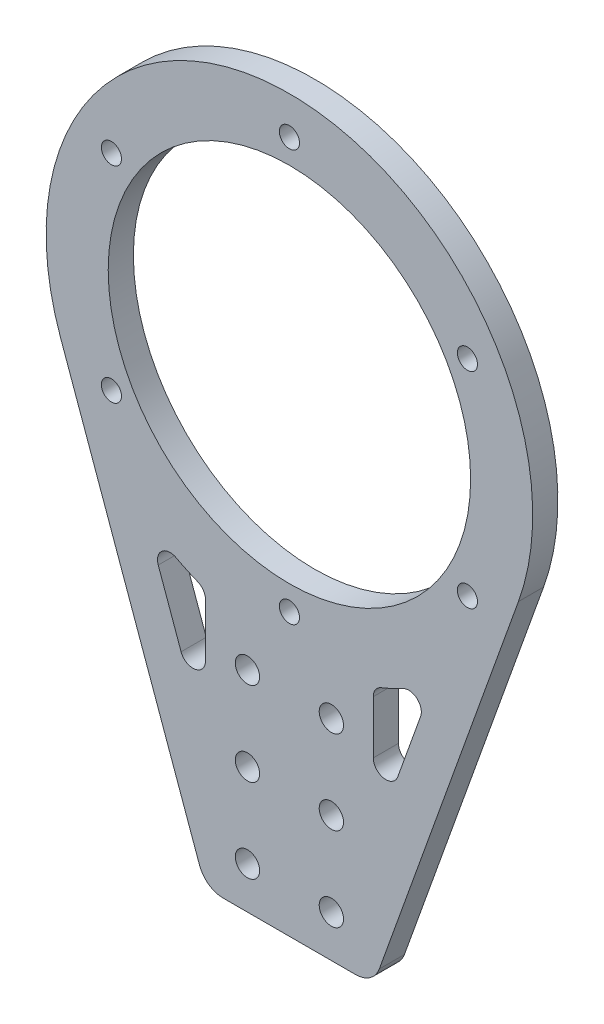
ISO-10303-21;
HEADER;
FILE_DESCRIPTION(('STEP AP214'),'2;1');
FILE_NAME('part.step','',(''),(''),'','','');
FILE_SCHEMA(('AUTOMOTIVE_DESIGN { 1 0 10303 214 1 1 1 1 }'));
ENDSEC;
DATA;
#1=APPLICATION_CONTEXT('core data for automotive mechanical design processes');
#2=APPLICATION_PROTOCOL_DEFINITION('international standard','automotive_design',2000,#1);
#3=PRODUCT_CONTEXT('',#1,'mechanical');
#4=PRODUCT('Part','Part','',(#3));
#5=PRODUCT_RELATED_PRODUCT_CATEGORY('part','',(#4));
#6=PRODUCT_DEFINITION_FORMATION('','',#4);
#7=PRODUCT_DEFINITION_CONTEXT('part definition',#1,'design');
#8=PRODUCT_DEFINITION('design','',#6,#7);
#9=PRODUCT_DEFINITION_SHAPE('','',#8);
#10=(LENGTH_UNIT() NAMED_UNIT(*) SI_UNIT(.MILLI.,.METRE.));
#11=(NAMED_UNIT(*) PLANE_ANGLE_UNIT() SI_UNIT($,.RADIAN.));
#12=(NAMED_UNIT(*) SI_UNIT($,.STERADIAN.) SOLID_ANGLE_UNIT());
#13=UNCERTAINTY_MEASURE_WITH_UNIT(LENGTH_MEASURE(1.E-05),#10,'distance_accuracy_value','');
#14=(GEOMETRIC_REPRESENTATION_CONTEXT(3) GLOBAL_UNCERTAINTY_ASSIGNED_CONTEXT((#13)) GLOBAL_UNIT_ASSIGNED_CONTEXT((#10,
#11,#12)) REPRESENTATION_CONTEXT('',''));
#15=CARTESIAN_POINT('',(0.,0.,0.));
#16=DIRECTION('',(0.,0.,1.));
#17=DIRECTION('',(1.,0.,0.));
#18=AXIS2_PLACEMENT_3D('',#15,#16,#17);
#19=CARTESIAN_POINT('',(0.,0.,3.));
#20=DIRECTION('',(0.,0.,-1.));
#21=DIRECTION('',(-1.,0.,0.));
#22=AXIS2_PLACEMENT_3D('',#19,#20,#21);
#23=PLANE('',#22);
#24=CARTESIAN_POINT('',(-5.,-33.,3.));
#25=DIRECTION('',(0.,0.,-1.));
#26=DIRECTION('',(-1.,0.,0.));
#27=AXIS2_PLACEMENT_3D('',#24,#25,#26);
#28=CIRCLE('',#27,1.45);
#29=CARTESIAN_POINT('',(-6.45,-33.,3.));
#30=VERTEX_POINT('',#29);
#31=EDGE_CURVE('E427',#30,#30,#28,.T.);
#32=ORIENTED_EDGE('',*,*,#31,.T.);
#33=EDGE_LOOP('',(#32));
#34=FACE_BOUND('',#33,.T.);
#35=CARTESIAN_POINT('',(-5.,-43.,3.));
#36=DIRECTION('',(0.,0.,-1.));
#37=DIRECTION('',(-1.,0.,0.));
#38=AXIS2_PLACEMENT_3D('',#35,#36,#37);
#39=CIRCLE('',#38,1.45);
#40=CARTESIAN_POINT('',(-6.45,-43.,3.));
#41=VERTEX_POINT('',#40);
#42=EDGE_CURVE('E434',#41,#41,#39,.T.);
#43=ORIENTED_EDGE('',*,*,#42,.T.);
#44=EDGE_LOOP('',(#43));
#45=FACE_BOUND('',#44,.T.);
#46=CARTESIAN_POINT('',(-5.,-53.,3.));
#47=DIRECTION('',(0.,0.,-1.));
#48=DIRECTION('',(-1.,0.,0.));
#49=AXIS2_PLACEMENT_3D('',#46,#47,#48);
#50=CIRCLE('',#49,1.45);
#51=CARTESIAN_POINT('',(-6.45,-53.,3.));
#52=VERTEX_POINT('',#51);
#53=EDGE_CURVE('E438',#52,#52,#50,.T.);
#54=ORIENTED_EDGE('',*,*,#53,.T.);
#55=EDGE_LOOP('',(#54));
#56=FACE_BOUND('',#55,.T.);
#57=CARTESIAN_POINT('',(5.,-53.,3.));
#58=DIRECTION('',(0.,0.,-1.));
#59=DIRECTION('',(-1.,0.,0.));
#60=AXIS2_PLACEMENT_3D('',#57,#58,#59);
#61=CIRCLE('',#60,1.45);
#62=CARTESIAN_POINT('',(3.55,-53.,3.));
#63=VERTEX_POINT('',#62);
#64=EDGE_CURVE('E442',#63,#63,#61,.T.);
#65=ORIENTED_EDGE('',*,*,#64,.T.);
#66=EDGE_LOOP('',(#65));
#67=FACE_BOUND('',#66,.T.);
#68=CARTESIAN_POINT('',(5.,-43.,3.));
#69=DIRECTION('',(0.,0.,-1.));
#70=DIRECTION('',(-1.,0.,0.));
#71=AXIS2_PLACEMENT_3D('',#68,#69,#70);
#72=CIRCLE('',#71,1.45);
#73=CARTESIAN_POINT('',(3.55,-43.,3.));
#74=VERTEX_POINT('',#73);
#75=EDGE_CURVE('E446',#74,#74,#72,.T.);
#76=ORIENTED_EDGE('',*,*,#75,.T.);
#77=EDGE_LOOP('',(#76));
#78=FACE_BOUND('',#77,.T.);
#79=CARTESIAN_POINT('',(5.,-33.,3.));
#80=DIRECTION('',(0.,0.,-1.));
#81=DIRECTION('',(-1.,0.,0.));
#82=AXIS2_PLACEMENT_3D('',#79,#80,#81);
#83=CIRCLE('',#82,1.45);
#84=CARTESIAN_POINT('',(3.55,-33.,3.));
#85=VERTEX_POINT('',#84);
#86=EDGE_CURVE('E450',#85,#85,#83,.T.);
#87=ORIENTED_EDGE('',*,*,#86,.T.);
#88=EDGE_LOOP('',(#87));
#89=FACE_BOUND('',#88,.T.);
#90=DIRECTION('',(0.337715842640856,-0.941248112683035,0.));
#91=VECTOR('',#90,1.);
#92=CARTESIAN_POINT('',(-9.99999999999999,-43.1946537038321,3.));
#93=LINE('',#92,#91);
#94=CARTESIAN_POINT('',(-15.6359598872288,-27.4866651015537,3.));
#95=VERTEX_POINT('',#94);
#96=CARTESIAN_POINT('',(-12.9118721690245,-35.0789723012771,3.));
#97=VERTEX_POINT('',#96);
#98=EDGE_CURVE('E347',#95,#97,#93,.T.);
#99=ORIENTED_EDGE('',*,*,#98,.F.);
#100=CARTESIAN_POINT('',(-14.2240877182043,-26.9800913375924,3.));
#101=DIRECTION('',(0.,0.,-1.));
#102=DIRECTION('',(-1.,0.,0.));
#103=AXIS2_PLACEMENT_3D('',#100,#101,#102);
#104=CIRCLE('',#103,1.5);
#105=CARTESIAN_POINT('',(-13.5245424205877,-25.6532015996781,3.));
#106=VERTEX_POINT('',#105);
#107=EDGE_CURVE('E283',#95,#106,#104,.T.);
#108=ORIENTED_EDGE('',*,*,#107,.T.);
#109=CARTESIAN_POINT('',(0.,0.,3.));
#110=DIRECTION('',(0.,0.,-1.));
#111=DIRECTION('',(-1.,0.,0.));
#112=AXIS2_PLACEMENT_3D('',#109,#110,#111);
#113=CIRCLE('',#112,29.);
#114=CARTESIAN_POINT('',(-10.9344262295082,-26.8596039254387,3.));
#115=VERTEX_POINT('',#114);
#116=EDGE_CURVE('E339',#115,#106,#113,.T.);
#117=ORIENTED_EDGE('',*,*,#116,.F.);
#118=CARTESIAN_POINT('',(-11.5,-28.2488937836511,3.));
#119=DIRECTION('',(0.,0.,-1.));
#120=DIRECTION('',(-1.,0.,0.));
#121=AXIS2_PLACEMENT_3D('',#118,#119,#120);
#122=CIRCLE('',#121,1.5);
#123=CARTESIAN_POINT('',(-9.99999999999999,-28.2488937836511,3.));
#124=VERTEX_POINT('',#123);
#125=EDGE_CURVE('E289',#115,#124,#122,.T.);
#126=ORIENTED_EDGE('',*,*,#125,.T.);
#127=DIRECTION('',(0.,1.,0.));
#128=VECTOR('',#127,1.);
#129=CARTESIAN_POINT('',(-9.99999999999999,-43.1946537038321,3.));
#130=LINE('',#129,#128);
#131=CARTESIAN_POINT('',(-9.99999999999999,-34.5723985373158,3.));
#132=VERTEX_POINT('',#131);
#133=EDGE_CURVE('E360',#132,#124,#130,.T.);
#134=ORIENTED_EDGE('',*,*,#133,.F.);
#135=CARTESIAN_POINT('',(-11.5,-34.5723985373158,3.));
#136=DIRECTION('',(0.,0.,-1.));
#137=DIRECTION('',(-1.,0.,0.));
#138=AXIS2_PLACEMENT_3D('',#135,#136,#137);
#139=CIRCLE('',#138,1.5);
#140=EDGE_CURVE('E277',#132,#97,#139,.T.);
#141=ORIENTED_EDGE('',*,*,#140,.T.);
#142=EDGE_LOOP('',(#99,#108,#117,#126,#134,#141));
#143=FACE_BOUND('',#142,.T.);
#144=DIRECTION('',(0.337715842640856,-0.941248112683036,0.));
#145=VECTOR('',#144,1.);
#146=CARTESIAN_POINT('',(-9.99999999999999,-58.,3.));
#147=LINE('',#146,#145);
#148=CARTESIAN_POINT('',(-27.296195267808,-9.79375943658483,3.));
#149=VERTEX_POINT('',#148);
#150=CARTESIAN_POINT('',(-10.7128742653178,-56.0131475279226,3.));
#151=VERTEX_POINT('',#150);
#152=EDGE_CURVE('E213',#149,#151,#147,.T.);
#153=ORIENTED_EDGE('',*,*,#152,.T.);
#154=CARTESIAN_POINT('',(-7.8891299272687,-55.,3.));
#155=DIRECTION('',(0.,0.,-1.));
#156=DIRECTION('',(-1.,0.,0.));
#157=AXIS2_PLACEMENT_3D('',#154,#155,#156);
#158=CIRCLE('',#157,3.);
#159=CARTESIAN_POINT('',(-7.8891299272687,-58.,3.));
#160=VERTEX_POINT('',#159);
#161=EDGE_CURVE('E54',#151,#160,#158,.F.);
#162=ORIENTED_EDGE('',*,*,#161,.T.);
#163=DIRECTION('',(1.,0.,0.));
#164=VECTOR('',#163,1.);
#165=CARTESIAN_POINT('',(-9.99999999999999,-58.,3.));
#166=LINE('',#165,#164);
#167=CARTESIAN_POINT('',(7.88912992726872,-58.,3.));
#168=VERTEX_POINT('',#167);
#169=EDGE_CURVE('E180',#160,#168,#166,.T.);
#170=ORIENTED_EDGE('',*,*,#169,.T.);
#171=CARTESIAN_POINT('',(7.88912992726872,-55.,3.));
#172=DIRECTION('',(0.,0.,-1.));
#173=DIRECTION('',(-1.,0.,0.));
#174=AXIS2_PLACEMENT_3D('',#171,#172,#173);
#175=CIRCLE('',#174,3.);
#176=CARTESIAN_POINT('',(10.7128742653178,-56.0131475279226,3.));
#177=VERTEX_POINT('',#176);
#178=EDGE_CURVE('E61',#168,#177,#175,.F.);
#179=ORIENTED_EDGE('',*,*,#178,.T.);
#180=DIRECTION('',(0.337715842640856,0.941248112683036,0.));
#181=VECTOR('',#180,1.);
#182=CARTESIAN_POINT('',(10.,-58.,3.));
#183=LINE('',#182,#181);
#184=CARTESIAN_POINT('',(27.296195267808,-9.79375943658482,3.));
#185=VERTEX_POINT('',#184);
#186=EDGE_CURVE('E171',#177,#185,#183,.T.);
#187=ORIENTED_EDGE('',*,*,#186,.T.);
#188=CARTESIAN_POINT('',(0.,0.,3.));
#189=DIRECTION('',(0.,0.,1.));
#190=DIRECTION('',(-1.,0.,0.));
#191=AXIS2_PLACEMENT_3D('',#188,#189,#190);
#192=CIRCLE('',#191,29.);
#193=EDGE_CURVE('E175',#185,#149,#192,.T.);
#194=ORIENTED_EDGE('',*,*,#193,.T.);
#195=EDGE_LOOP('',(#153,#162,#170,#179,#187,#194));
#196=FACE_BOUND('',#195,.T.);
#197=CARTESIAN_POINT('',(0.,0.,3.));
#198=DIRECTION('',(0.,0.,1.));
#199=DIRECTION('',(1.,0.,0.));
#200=AXIS2_PLACEMENT_3D('',#197,#198,#199);
#201=CIRCLE('',#200,21.6);
#202=CARTESIAN_POINT('',(21.6,0.,3.));
#203=VERTEX_POINT('',#202);
#204=EDGE_CURVE('E205',#203,#203,#201,.T.);
#205=ORIENTED_EDGE('',*,*,#204,.F.);
#206=EDGE_LOOP('',(#205));
#207=FACE_BOUND('',#206,.T.);
#208=CARTESIAN_POINT('',(0.,24.5,3.));
#209=DIRECTION('',(0.,0.,1.));
#210=DIRECTION('',(1.,0.,0.));
#211=AXIS2_PLACEMENT_3D('',#208,#209,#210);
#212=CIRCLE('',#211,1.2);
#213=CARTESIAN_POINT('',(1.2,24.5,3.));
#214=VERTEX_POINT('',#213);
#215=EDGE_CURVE('E331',#214,#214,#212,.T.);
#216=ORIENTED_EDGE('',*,*,#215,.F.);
#217=EDGE_LOOP('',(#216));
#218=FACE_BOUND('',#217,.T.);
#219=DIRECTION('',(0.337715842640856,0.941248112683036,0.));
#220=VECTOR('',#219,1.);
#221=CARTESIAN_POINT('',(10.,-43.1946537038321,3.));
#222=LINE('',#221,#220);
#223=CARTESIAN_POINT('',(12.9118721690246,-35.0789723012771,3.));
#224=VERTEX_POINT('',#223);
#225=CARTESIAN_POINT('',(15.6359598872288,-27.4866651015537,3.));
#226=VERTEX_POINT('',#225);
#227=EDGE_CURVE('E371',#224,#226,#222,.T.);
#228=ORIENTED_EDGE('',*,*,#227,.F.);
#229=CARTESIAN_POINT('',(11.5,-34.5723985373158,3.));
#230=DIRECTION('',(0.,0.,-1.));
#231=DIRECTION('',(-1.,0.,0.));
#232=AXIS2_PLACEMENT_3D('',#229,#230,#231);
#233=CIRCLE('',#232,1.5);
#234=CARTESIAN_POINT('',(10.,-34.5723985373158,3.));
#235=VERTEX_POINT('',#234);
#236=EDGE_CURVE('E265',#224,#235,#233,.T.);
#237=ORIENTED_EDGE('',*,*,#236,.T.);
#238=DIRECTION('',(0.,-1.,0.));
#239=VECTOR('',#238,1.);
#240=CARTESIAN_POINT('',(10.,-43.1946537038321,3.));
#241=LINE('',#240,#239);
#242=CARTESIAN_POINT('',(10.,-28.2488937836511,3.));
#243=VERTEX_POINT('',#242);
#244=EDGE_CURVE('E356',#243,#235,#241,.T.);
#245=ORIENTED_EDGE('',*,*,#244,.F.);
#246=CARTESIAN_POINT('',(11.5,-28.2488937836511,3.));
#247=DIRECTION('',(0.,0.,-1.));
#248=DIRECTION('',(-1.,0.,0.));
#249=AXIS2_PLACEMENT_3D('',#246,#247,#248);
#250=CIRCLE('',#249,1.5);
#251=CARTESIAN_POINT('',(10.9344262295082,-26.8596039254387,3.));
#252=VERTEX_POINT('',#251);
#253=EDGE_CURVE('E271',#243,#252,#250,.T.);
#254=ORIENTED_EDGE('',*,*,#253,.T.);
#255=CARTESIAN_POINT('',(0.,0.,3.));
#256=DIRECTION('',(0.,0.,-1.));
#257=DIRECTION('',(1.,0.,0.));
#258=AXIS2_PLACEMENT_3D('',#255,#256,#257);
#259=CIRCLE('',#258,29.);
#260=CARTESIAN_POINT('',(13.5245424205877,-25.6532015996781,3.));
#261=VERTEX_POINT('',#260);
#262=EDGE_CURVE('E384',#261,#252,#259,.T.);
#263=ORIENTED_EDGE('',*,*,#262,.F.);
#264=CARTESIAN_POINT('',(14.2240877182043,-26.9800913375924,3.));
#265=DIRECTION('',(0.,0.,-1.));
#266=DIRECTION('',(-1.,0.,0.));
#267=AXIS2_PLACEMENT_3D('',#264,#265,#266);
#268=CIRCLE('',#267,1.5);
#269=EDGE_CURVE('E259',#261,#226,#268,.T.);
#270=ORIENTED_EDGE('',*,*,#269,.T.);
#271=EDGE_LOOP('',(#228,#237,#245,#254,#263,#270));
#272=FACE_BOUND('',#271,.T.);
#273=CARTESIAN_POINT('',(21.2176223927188,12.25,3.));
#274=DIRECTION('',(0.,0.,1.));
#275=DIRECTION('',(1.,0.,0.));
#276=AXIS2_PLACEMENT_3D('',#273,#274,#275);
#277=CIRCLE('',#276,1.2);
#278=CARTESIAN_POINT('',(22.4176223927188,12.25,3.));
#279=VERTEX_POINT('',#278);
#280=EDGE_CURVE('E380',#279,#279,#277,.T.);
#281=ORIENTED_EDGE('',*,*,#280,.F.);
#282=EDGE_LOOP('',(#281));
#283=FACE_BOUND('',#282,.T.);
#284=CARTESIAN_POINT('',(21.2176223927187,-12.2500000000001,3.));
#285=DIRECTION('',(0.,0.,1.));
#286=DIRECTION('',(1.,0.,0.));
#287=AXIS2_PLACEMENT_3D('',#284,#285,#286);
#288=CIRCLE('',#287,1.2);
#289=CARTESIAN_POINT('',(22.4176223927187,-12.2500000000001,3.));
#290=VERTEX_POINT('',#289);
#291=EDGE_CURVE('E395',#290,#290,#288,.T.);
#292=ORIENTED_EDGE('',*,*,#291,.F.);
#293=EDGE_LOOP('',(#292));
#294=FACE_BOUND('',#293,.T.);
#295=CARTESIAN_POINT('',(-1.71082585603314E-13,-24.5,3.));
#296=DIRECTION('',(0.,0.,1.));
#297=DIRECTION('',(1.,0.,0.));
#298=AXIS2_PLACEMENT_3D('',#295,#296,#297);
#299=CIRCLE('',#298,1.2);
#300=CARTESIAN_POINT('',(1.19999999999983,-24.5,3.));
#301=VERTEX_POINT('',#300);
#302=EDGE_CURVE('E403',#301,#301,#299,.T.);
#303=ORIENTED_EDGE('',*,*,#302,.F.);
#304=EDGE_LOOP('',(#303));
#305=FACE_BOUND('',#304,.T.);
#306=CARTESIAN_POINT('',(-21.2176223927189,-12.2499999999998,3.));
#307=DIRECTION('',(0.,0.,1.));
#308=DIRECTION('',(1.,0.,0.));
#309=AXIS2_PLACEMENT_3D('',#306,#307,#308);
#310=CIRCLE('',#309,1.2);
#311=CARTESIAN_POINT('',(-20.0176223927189,-12.2499999999998,3.));
#312=VERTEX_POINT('',#311);
#313=EDGE_CURVE('E411',#312,#312,#310,.T.);
#314=ORIENTED_EDGE('',*,*,#313,.F.);
#315=EDGE_LOOP('',(#314));
#316=FACE_BOUND('',#315,.T.);
#317=CARTESIAN_POINT('',(-21.2176223927186,12.2500000000002,3.));
#318=DIRECTION('',(0.,0.,1.));
#319=DIRECTION('',(1.,0.,0.));
#320=AXIS2_PLACEMENT_3D('',#317,#318,#319);
#321=CIRCLE('',#320,1.2);
#322=CARTESIAN_POINT('',(-20.0176223927186,12.2500000000002,3.));
#323=VERTEX_POINT('',#322);
#324=EDGE_CURVE('E419',#323,#323,#321,.T.);
#325=ORIENTED_EDGE('',*,*,#324,.F.);
#326=EDGE_LOOP('',(#325));
#327=FACE_BOUND('',#326,.T.);
#328=ADVANCED_FACE('F45',(#34,#45,#56,#67,#78,#89,#143,#196,#207,#218,#272,#283,#294,#305,#316,
#327),#23,.F.);
#329=CARTESIAN_POINT('',(0.,0.,0.));
#330=DIRECTION('',(0.,0.,-1.));
#331=DIRECTION('',(-1.,0.,0.));
#332=AXIS2_PLACEMENT_3D('',#329,#330,#331);
#333=PLANE('',#332);
#334=CARTESIAN_POINT('',(-5.,-33.,0.));
#335=DIRECTION('',(0.,0.,-1.));
#336=DIRECTION('',(1.,0.,0.));
#337=AXIS2_PLACEMENT_3D('',#334,#335,#336);
#338=CIRCLE('',#337,1.45);
#339=CARTESIAN_POINT('',(-3.55,-33.,0.));
#340=VERTEX_POINT('',#339);
#341=EDGE_CURVE('E459',#340,#340,#338,.T.);
#342=ORIENTED_EDGE('',*,*,#341,.F.);
#343=EDGE_LOOP('',(#342));
#344=FACE_BOUND('',#343,.T.);
#345=CARTESIAN_POINT('',(-5.,-43.,0.));
#346=DIRECTION('',(0.,0.,-1.));
#347=DIRECTION('',(1.,0.,0.));
#348=AXIS2_PLACEMENT_3D('',#345,#346,#347);
#349=CIRCLE('',#348,1.45);
#350=CARTESIAN_POINT('',(-3.55,-43.,0.));
#351=VERTEX_POINT('',#350);
#352=EDGE_CURVE('E463',#351,#351,#349,.T.);
#353=ORIENTED_EDGE('',*,*,#352,.F.);
#354=EDGE_LOOP('',(#353));
#355=FACE_BOUND('',#354,.T.);
#356=CARTESIAN_POINT('',(-5.,-53.,0.));
#357=DIRECTION('',(0.,0.,-1.));
#358=DIRECTION('',(1.,0.,0.));
#359=AXIS2_PLACEMENT_3D('',#356,#357,#358);
#360=CIRCLE('',#359,1.45);
#361=CARTESIAN_POINT('',(-3.55,-53.,0.));
#362=VERTEX_POINT('',#361);
#363=EDGE_CURVE('E467',#362,#362,#360,.T.);
#364=ORIENTED_EDGE('',*,*,#363,.F.);
#365=EDGE_LOOP('',(#364));
#366=FACE_BOUND('',#365,.T.);
#367=CARTESIAN_POINT('',(5.,-53.,0.));
#368=DIRECTION('',(0.,0.,-1.));
#369=DIRECTION('',(-1.,0.,0.));
#370=AXIS2_PLACEMENT_3D('',#367,#368,#369);
#371=CIRCLE('',#370,1.45);
#372=CARTESIAN_POINT('',(3.55,-53.,0.));
#373=VERTEX_POINT('',#372);
#374=EDGE_CURVE('E471',#373,#373,#371,.T.);
#375=ORIENTED_EDGE('',*,*,#374,.F.);
#376=EDGE_LOOP('',(#375));
#377=FACE_BOUND('',#376,.T.);
#378=CARTESIAN_POINT('',(5.,-43.,0.));
#379=DIRECTION('',(0.,0.,-1.));
#380=DIRECTION('',(-1.,0.,0.));
#381=AXIS2_PLACEMENT_3D('',#378,#379,#380);
#382=CIRCLE('',#381,1.45);
#383=CARTESIAN_POINT('',(3.55,-43.,0.));
#384=VERTEX_POINT('',#383);
#385=EDGE_CURVE('E458',#384,#384,#382,.T.);
#386=ORIENTED_EDGE('',*,*,#385,.F.);
#387=EDGE_LOOP('',(#386));
#388=FACE_BOUND('',#387,.T.);
#389=CARTESIAN_POINT('',(5.,-33.,0.));
#390=DIRECTION('',(0.,0.,-1.));
#391=DIRECTION('',(-1.,0.,0.));
#392=AXIS2_PLACEMENT_3D('',#389,#390,#391);
#393=CIRCLE('',#392,1.45);
#394=CARTESIAN_POINT('',(3.55,-33.,0.));
#395=VERTEX_POINT('',#394);
#396=EDGE_CURVE('E454',#395,#395,#393,.T.);
#397=ORIENTED_EDGE('',*,*,#396,.F.);
#398=EDGE_LOOP('',(#397));
#399=FACE_BOUND('',#398,.T.);
#400=CARTESIAN_POINT('',(-21.2176223927189,-12.2499999999998,0.));
#401=DIRECTION('',(0.,0.,1.));
#402=DIRECTION('',(1.,0.,0.));
#403=AXIS2_PLACEMENT_3D('',#400,#401,#402);
#404=CIRCLE('',#403,1.2);
#405=CARTESIAN_POINT('',(-20.0176223927189,-12.2499999999998,0.));
#406=VERTEX_POINT('',#405);
#407=EDGE_CURVE('E415',#406,#406,#404,.T.);
#408=ORIENTED_EDGE('',*,*,#407,.T.);
#409=EDGE_LOOP('',(#408));
#410=FACE_BOUND('',#409,.T.);
#411=CARTESIAN_POINT('',(21.2176223927187,-12.2500000000001,0.));
#412=DIRECTION('',(0.,0.,1.));
#413=DIRECTION('',(1.,0.,0.));
#414=AXIS2_PLACEMENT_3D('',#411,#412,#413);
#415=CIRCLE('',#414,1.2);
#416=CARTESIAN_POINT('',(22.4176223927187,-12.2500000000001,0.));
#417=VERTEX_POINT('',#416);
#418=EDGE_CURVE('E399',#417,#417,#415,.T.);
#419=ORIENTED_EDGE('',*,*,#418,.T.);
#420=EDGE_LOOP('',(#419));
#421=FACE_BOUND('',#420,.T.);
#422=CARTESIAN_POINT('',(0.,0.,0.));
#423=DIRECTION('',(0.,0.,-1.));
#424=DIRECTION('',(1.,0.,0.));
#425=AXIS2_PLACEMENT_3D('',#422,#423,#424);
#426=CIRCLE('',#425,29.);
#427=CARTESIAN_POINT('',(13.5245424205877,-25.6532015996781,0.));
#428=VERTEX_POINT('',#427);
#429=CARTESIAN_POINT('',(10.9344262295082,-26.8596039254387,0.));
#430=VERTEX_POINT('',#429);
#431=EDGE_CURVE('E372',#428,#430,#426,.T.);
#432=ORIENTED_EDGE('',*,*,#431,.T.);
#433=CARTESIAN_POINT('',(11.5,-28.2488937836511,0.));
#434=DIRECTION('',(0.,0.,-1.));
#435=DIRECTION('',(-1.,0.,0.));
#436=AXIS2_PLACEMENT_3D('',#433,#434,#435);
#437=CIRCLE('',#436,1.5);
#438=CARTESIAN_POINT('',(10.,-28.2488937836511,0.));
#439=VERTEX_POINT('',#438);
#440=EDGE_CURVE('E268',#430,#439,#437,.F.);
#441=ORIENTED_EDGE('',*,*,#440,.T.);
#442=DIRECTION('',(0.,-1.,0.));
#443=VECTOR('',#442,1.);
#444=CARTESIAN_POINT('',(10.,-43.1946537038321,0.));
#445=LINE('',#444,#443);
#446=CARTESIAN_POINT('',(10.,-34.5723985373158,0.));
#447=VERTEX_POINT('',#446);
#448=EDGE_CURVE('E367',#439,#447,#445,.T.);
#449=ORIENTED_EDGE('',*,*,#448,.T.);
#450=CARTESIAN_POINT('',(11.5,-34.5723985373158,0.));
#451=DIRECTION('',(0.,0.,-1.));
#452=DIRECTION('',(-1.,0.,0.));
#453=AXIS2_PLACEMENT_3D('',#450,#451,#452);
#454=CIRCLE('',#453,1.5);
#455=CARTESIAN_POINT('',(12.9118721690246,-35.0789723012771,0.));
#456=VERTEX_POINT('',#455);
#457=EDGE_CURVE('E262',#447,#456,#454,.F.);
#458=ORIENTED_EDGE('',*,*,#457,.T.);
#459=DIRECTION('',(0.337715842640856,0.941248112683036,0.));
#460=VECTOR('',#459,1.);
#461=CARTESIAN_POINT('',(10.,-43.1946537038321,0.));
#462=LINE('',#461,#460);
#463=CARTESIAN_POINT('',(15.6359598872288,-27.4866651015537,0.));
#464=VERTEX_POINT('',#463);
#465=EDGE_CURVE('E376',#456,#464,#462,.T.);
#466=ORIENTED_EDGE('',*,*,#465,.T.);
#467=CARTESIAN_POINT('',(14.2240877182043,-26.9800913375924,0.));
#468=DIRECTION('',(0.,0.,-1.));
#469=DIRECTION('',(-1.,0.,0.));
#470=AXIS2_PLACEMENT_3D('',#467,#468,#469);
#471=CIRCLE('',#470,1.5);
#472=EDGE_CURVE('E256',#464,#428,#471,.F.);
#473=ORIENTED_EDGE('',*,*,#472,.T.);
#474=EDGE_LOOP('',(#432,#441,#449,#458,#466,#473));
#475=FACE_BOUND('',#474,.T.);
#476=DIRECTION('',(0.,1.,0.));
#477=VECTOR('',#476,1.);
#478=CARTESIAN_POINT('',(-9.99999999999999,-43.1946537038321,0.));
#479=LINE('',#478,#477);
#480=CARTESIAN_POINT('',(-9.99999999999999,-34.5723985373158,0.));
#481=VERTEX_POINT('',#480);
#482=CARTESIAN_POINT('',(-9.99999999999999,-28.2488937836511,0.));
#483=VERTEX_POINT('',#482);
#484=EDGE_CURVE('E348',#481,#483,#479,.T.);
#485=ORIENTED_EDGE('',*,*,#484,.T.);
#486=CARTESIAN_POINT('',(-11.5,-28.2488937836511,0.));
#487=DIRECTION('',(0.,0.,-1.));
#488=DIRECTION('',(-1.,0.,0.));
#489=AXIS2_PLACEMENT_3D('',#486,#487,#488);
#490=CIRCLE('',#489,1.5);
#491=CARTESIAN_POINT('',(-10.9344262295082,-26.8596039254387,0.));
#492=VERTEX_POINT('',#491);
#493=EDGE_CURVE('E286',#483,#492,#490,.F.);
#494=ORIENTED_EDGE('',*,*,#493,.T.);
#495=CARTESIAN_POINT('',(0.,0.,0.));
#496=DIRECTION('',(0.,0.,-1.));
#497=DIRECTION('',(-1.,0.,0.));
#498=AXIS2_PLACEMENT_3D('',#495,#496,#497);
#499=CIRCLE('',#498,29.);
#500=CARTESIAN_POINT('',(-13.5245424205877,-25.6532015996781,0.));
#501=VERTEX_POINT('',#500);
#502=EDGE_CURVE('E343',#492,#501,#499,.T.);
#503=ORIENTED_EDGE('',*,*,#502,.T.);
#504=CARTESIAN_POINT('',(-14.2240877182043,-26.9800913375924,0.));
#505=DIRECTION('',(0.,0.,-1.));
#506=DIRECTION('',(-1.,0.,0.));
#507=AXIS2_PLACEMENT_3D('',#504,#505,#506);
#508=CIRCLE('',#507,1.5);
#509=CARTESIAN_POINT('',(-15.6359598872288,-27.4866651015537,0.));
#510=VERTEX_POINT('',#509);
#511=EDGE_CURVE('E280',#501,#510,#508,.F.);
#512=ORIENTED_EDGE('',*,*,#511,.T.);
#513=DIRECTION('',(0.337715842640856,-0.941248112683035,0.));
#514=VECTOR('',#513,1.);
#515=CARTESIAN_POINT('',(-9.99999999999999,-43.1946537038321,0.));
#516=LINE('',#515,#514);
#517=CARTESIAN_POINT('',(-12.9118721690245,-35.0789723012771,0.));
#518=VERTEX_POINT('',#517);
#519=EDGE_CURVE('E352',#510,#518,#516,.T.);
#520=ORIENTED_EDGE('',*,*,#519,.T.);
#521=CARTESIAN_POINT('',(-11.5,-34.5723985373158,0.));
#522=DIRECTION('',(0.,0.,-1.));
#523=DIRECTION('',(-1.,0.,0.));
#524=AXIS2_PLACEMENT_3D('',#521,#522,#523);
#525=CIRCLE('',#524,1.5);
#526=EDGE_CURVE('E274',#518,#481,#525,.F.);
#527=ORIENTED_EDGE('',*,*,#526,.T.);
#528=EDGE_LOOP('',(#485,#494,#503,#512,#520,#527));
#529=FACE_BOUND('',#528,.T.);
#530=CARTESIAN_POINT('',(0.,24.5,0.));
#531=DIRECTION('',(0.,0.,1.));
#532=DIRECTION('',(1.,0.,0.));
#533=AXIS2_PLACEMENT_3D('',#530,#531,#532);
#534=CIRCLE('',#533,1.2);
#535=CARTESIAN_POINT('',(1.2,24.5,0.));
#536=VERTEX_POINT('',#535);
#537=EDGE_CURVE('E335',#536,#536,#534,.T.);
#538=ORIENTED_EDGE('',*,*,#537,.T.);
#539=EDGE_LOOP('',(#538));
#540=FACE_BOUND('',#539,.T.);
#541=DIRECTION('',(1.,0.,0.));
#542=VECTOR('',#541,1.);
#543=CARTESIAN_POINT('',(-9.99999999999999,-58.,0.));
#544=LINE('',#543,#542);
#545=CARTESIAN_POINT('',(-7.8891299272687,-58.,0.));
#546=VERTEX_POINT('',#545);
#547=CARTESIAN_POINT('',(7.88912992726872,-58.,0.));
#548=VERTEX_POINT('',#547);
#549=EDGE_CURVE('E204',#546,#548,#544,.T.);
#550=ORIENTED_EDGE('',*,*,#549,.F.);
#551=CARTESIAN_POINT('',(-7.8891299272687,-55.,0.));
#552=DIRECTION('',(0.,0.,-1.));
#553=DIRECTION('',(-1.,0.,0.));
#554=AXIS2_PLACEMENT_3D('',#551,#552,#553);
#555=CIRCLE('',#554,3.);
#556=CARTESIAN_POINT('',(-10.7128742653178,-56.0131475279226,0.));
#557=VERTEX_POINT('',#556);
#558=EDGE_CURVE('E302',#546,#557,#555,.T.);
#559=ORIENTED_EDGE('',*,*,#558,.T.);
#560=DIRECTION('',(0.337715842640856,-0.941248112683036,0.));
#561=VECTOR('',#560,1.);
#562=CARTESIAN_POINT('',(-9.99999999999999,-58.,0.));
#563=LINE('',#562,#561);
#564=CARTESIAN_POINT('',(-27.296195267808,-9.79375943658483,0.));
#565=VERTEX_POINT('',#564);
#566=EDGE_CURVE('E201',#565,#557,#563,.T.);
#567=ORIENTED_EDGE('',*,*,#566,.F.);
#568=CARTESIAN_POINT('',(0.,0.,0.));
#569=DIRECTION('',(0.,0.,1.));
#570=DIRECTION('',(-1.,0.,0.));
#571=AXIS2_PLACEMENT_3D('',#568,#569,#570);
#572=CIRCLE('',#571,29.);
#573=CARTESIAN_POINT('',(27.296195267808,-9.79375943658482,0.));
#574=VERTEX_POINT('',#573);
#575=EDGE_CURVE('E211',#574,#565,#572,.T.);
#576=ORIENTED_EDGE('',*,*,#575,.F.);
#577=DIRECTION('',(0.337715842640856,0.941248112683036,0.));
#578=VECTOR('',#577,1.);
#579=CARTESIAN_POINT('',(10.,-58.,0.));
#580=LINE('',#579,#578);
#581=CARTESIAN_POINT('',(10.7128742653178,-56.0131475279226,0.));
#582=VERTEX_POINT('',#581);
#583=EDGE_CURVE('E186',#582,#574,#580,.T.);
#584=ORIENTED_EDGE('',*,*,#583,.F.);
#585=CARTESIAN_POINT('',(7.88912992726872,-55.,0.));
#586=DIRECTION('',(0.,0.,-1.));
#587=DIRECTION('',(-1.,0.,0.));
#588=AXIS2_PLACEMENT_3D('',#585,#586,#587);
#589=CIRCLE('',#588,3.);
#590=EDGE_CURVE('E299',#582,#548,#589,.T.);
#591=ORIENTED_EDGE('',*,*,#590,.T.);
#592=EDGE_LOOP('',(#550,#559,#567,#576,#584,#591));
#593=FACE_BOUND('',#592,.T.);
#594=CARTESIAN_POINT('',(0.,0.,0.));
#595=DIRECTION('',(0.,0.,1.));
#596=DIRECTION('',(1.,0.,0.));
#597=AXIS2_PLACEMENT_3D('',#594,#595,#596);
#598=CIRCLE('',#597,21.6);
#599=CARTESIAN_POINT('',(21.6,0.,0.));
#600=VERTEX_POINT('',#599);
#601=EDGE_CURVE('E327',#600,#600,#598,.T.);
#602=ORIENTED_EDGE('',*,*,#601,.T.);
#603=EDGE_LOOP('',(#602));
#604=FACE_BOUND('',#603,.T.);
#605=CARTESIAN_POINT('',(21.2176223927188,12.25,0.));
#606=DIRECTION('',(0.,0.,1.));
#607=DIRECTION('',(1.,0.,0.));
#608=AXIS2_PLACEMENT_3D('',#605,#606,#607);
#609=CIRCLE('',#608,1.2);
#610=CARTESIAN_POINT('',(22.4176223927188,12.25,0.));
#611=VERTEX_POINT('',#610);
#612=EDGE_CURVE('E391',#611,#611,#609,.T.);
#613=ORIENTED_EDGE('',*,*,#612,.T.);
#614=EDGE_LOOP('',(#613));
#615=FACE_BOUND('',#614,.T.);
#616=CARTESIAN_POINT('',(-1.71082585603314E-13,-24.5,0.));
#617=DIRECTION('',(0.,0.,1.));
#618=DIRECTION('',(1.,0.,0.));
#619=AXIS2_PLACEMENT_3D('',#616,#617,#618);
#620=CIRCLE('',#619,1.2);
#621=CARTESIAN_POINT('',(1.19999999999983,-24.5,0.));
#622=VERTEX_POINT('',#621);
#623=EDGE_CURVE('E407',#622,#622,#620,.T.);
#624=ORIENTED_EDGE('',*,*,#623,.T.);
#625=EDGE_LOOP('',(#624));
#626=FACE_BOUND('',#625,.T.);
#627=CARTESIAN_POINT('',(-21.2176223927186,12.2500000000002,0.));
#628=DIRECTION('',(0.,0.,1.));
#629=DIRECTION('',(1.,0.,0.));
#630=AXIS2_PLACEMENT_3D('',#627,#628,#629);
#631=CIRCLE('',#630,1.2);
#632=CARTESIAN_POINT('',(-20.0176223927186,12.2500000000002,0.));
#633=VERTEX_POINT('',#632);
#634=EDGE_CURVE('E423',#633,#633,#631,.T.);
#635=ORIENTED_EDGE('',*,*,#634,.T.);
#636=EDGE_LOOP('',(#635));
#637=FACE_BOUND('',#636,.T.);
#638=ADVANCED_FACE('F321',(#344,#355,#366,#377,#388,#399,#410,#421,#475,#529,#540,#593,#604,
#615,#626,#637),#333,.T.);
#639=CARTESIAN_POINT('',(-9.99999999999999,-58.,3.));
#640=DIRECTION('',(0.941248112683036,0.337715842640856,0.));
#641=DIRECTION('',(-0.337715842640856,0.941248112683036,0.));
#642=AXIS2_PLACEMENT_3D('',#639,#640,#641);
#643=PLANE('',#642);
#644=ORIENTED_EDGE('',*,*,#566,.T.);
#645=DIRECTION('',(0.,0.,-1.));
#646=VECTOR('',#645,1.);
#647=CARTESIAN_POINT('',(-10.7128742653178,-56.0131475279226,3.));
#648=LINE('',#647,#646);
#649=EDGE_CURVE('E69',#557,#151,#648,.F.);
#650=ORIENTED_EDGE('',*,*,#649,.T.);
#651=ORIENTED_EDGE('',*,*,#152,.F.);
#652=DIRECTION('',(0.,0.,-1.));
#653=VECTOR('',#652,1.);
#654=CARTESIAN_POINT('',(-27.296195267808,-9.79375943658483,3.));
#655=LINE('',#654,#653);
#656=EDGE_CURVE('E191',#149,#565,#655,.T.);
#657=ORIENTED_EDGE('',*,*,#656,.T.);
#658=EDGE_LOOP('',(#644,#650,#651,#657));
#659=FACE_BOUND('',#658,.T.);
#660=ADVANCED_FACE('F323',(#659),#643,.F.);
#661=CARTESIAN_POINT('',(-9.99999999999999,-58.,3.));
#662=DIRECTION('',(0.,1.,0.));
#663=DIRECTION('',(0.,0.,1.));
#664=AXIS2_PLACEMENT_3D('',#661,#662,#663);
#665=PLANE('',#664);
#666=ORIENTED_EDGE('',*,*,#169,.F.);
#667=DIRECTION('',(0.,0.,-1.));
#668=VECTOR('',#667,1.);
#669=CARTESIAN_POINT('',(-7.8891299272687,-58.,3.));
#670=LINE('',#669,#668);
#671=EDGE_CURVE('E295',#160,#546,#670,.T.);
#672=ORIENTED_EDGE('',*,*,#671,.T.);
#673=ORIENTED_EDGE('',*,*,#549,.T.);
#674=DIRECTION('',(0.,0.,-1.));
#675=VECTOR('',#674,1.);
#676=CARTESIAN_POINT('',(7.88912992726872,-58.,3.));
#677=LINE('',#676,#675);
#678=EDGE_CURVE('E292',#548,#168,#677,.F.);
#679=ORIENTED_EDGE('',*,*,#678,.T.);
#680=EDGE_LOOP('',(#666,#672,#673,#679));
#681=FACE_BOUND('',#680,.T.);
#682=ADVANCED_FACE('F314',(#681),#665,.F.);
#683=CARTESIAN_POINT('',(10.,-58.,3.));
#684=DIRECTION('',(-0.941248112683036,0.337715842640856,0.));
#685=DIRECTION('',(-0.337715842640856,-0.941248112683036,0.));
#686=AXIS2_PLACEMENT_3D('',#683,#684,#685);
#687=PLANE('',#686);
#688=ORIENTED_EDGE('',*,*,#186,.F.);
#689=DIRECTION('',(0.,0.,-1.));
#690=VECTOR('',#689,1.);
#691=CARTESIAN_POINT('',(10.7128742653178,-56.0131475279226,3.));
#692=LINE('',#691,#690);
#693=EDGE_CURVE('E11',#177,#582,#692,.T.);
#694=ORIENTED_EDGE('',*,*,#693,.T.);
#695=ORIENTED_EDGE('',*,*,#583,.T.);
#696=DIRECTION('',(0.,0.,-1.));
#697=VECTOR('',#696,1.);
#698=CARTESIAN_POINT('',(27.296195267808,-9.79375943658482,3.));
#699=LINE('',#698,#697);
#700=EDGE_CURVE('E183',#185,#574,#699,.T.);
#701=ORIENTED_EDGE('',*,*,#700,.F.);
#702=EDGE_LOOP('',(#688,#694,#695,#701));
#703=FACE_BOUND('',#702,.T.);
#704=ADVANCED_FACE('F184',(#703),#687,.F.);
#705=CARTESIAN_POINT('',(0.,0.,3.));
#706=DIRECTION('',(0.,0.,-1.));
#707=DIRECTION('',(-1.,0.,0.));
#708=AXIS2_PLACEMENT_3D('',#705,#706,#707);
#709=CYLINDRICAL_SURFACE('',#708,29.);
#710=ORIENTED_EDGE('',*,*,#575,.T.);
#711=ORIENTED_EDGE('',*,*,#656,.F.);
#712=ORIENTED_EDGE('',*,*,#193,.F.);
#713=ORIENTED_EDGE('',*,*,#700,.T.);
#714=EDGE_LOOP('',(#710,#711,#712,#713));
#715=FACE_BOUND('',#714,.T.);
#716=ADVANCED_FACE('F193',(#715),#709,.T.);
#717=CARTESIAN_POINT('',(0.,0.,3.));
#718=DIRECTION('',(0.,0.,-1.));
#719=DIRECTION('',(-1.,0.,0.));
#720=AXIS2_PLACEMENT_3D('',#717,#718,#719);
#721=CYLINDRICAL_SURFACE('',#720,21.6);
#722=ORIENTED_EDGE('',*,*,#204,.T.);
#723=EDGE_LOOP('',(#722));
#724=FACE_BOUND('',#723,.T.);
#725=ORIENTED_EDGE('',*,*,#601,.F.);
#726=EDGE_LOOP('',(#725));
#727=FACE_BOUND('',#726,.T.);
#728=ADVANCED_FACE('F501',(#724,#727),#721,.F.);
#729=CARTESIAN_POINT('',(0.,24.5,3.));
#730=DIRECTION('',(0.,0.,-1.));
#731=DIRECTION('',(-1.,0.,0.));
#732=AXIS2_PLACEMENT_3D('',#729,#730,#731);
#733=CYLINDRICAL_SURFACE('',#732,1.2);
#734=ORIENTED_EDGE('',*,*,#215,.T.);
#735=EDGE_LOOP('',(#734));
#736=FACE_BOUND('',#735,.T.);
#737=ORIENTED_EDGE('',*,*,#537,.F.);
#738=EDGE_LOOP('',(#737));
#739=FACE_BOUND('',#738,.T.);
#740=ADVANCED_FACE('F498',(#736,#739),#733,.F.);
#741=CARTESIAN_POINT('',(-9.99999999999999,-43.1946537038321,3.));
#742=DIRECTION('',(0.941248112683036,0.337715842640856,0.));
#743=DIRECTION('',(-0.337715842640856,0.941248112683036,0.));
#744=AXIS2_PLACEMENT_3D('',#741,#742,#743);
#745=PLANE('',#744);
#746=ORIENTED_EDGE('',*,*,#98,.T.);
#747=DIRECTION('',(0.,0.,-1.));
#748=VECTOR('',#747,1.);
#749=CARTESIAN_POINT('',(-12.9118721690245,-35.0789723012771,0.));
#750=LINE('',#749,#748);
#751=EDGE_CURVE('E238',#97,#518,#750,.T.);
#752=ORIENTED_EDGE('',*,*,#751,.T.);
#753=ORIENTED_EDGE('',*,*,#519,.F.);
#754=DIRECTION('',(0.,0.,1.));
#755=VECTOR('',#754,1.);
#756=CARTESIAN_POINT('',(-15.6359598872288,-27.4866651015537,3.));
#757=LINE('',#756,#755);
#758=EDGE_CURVE('E235',#510,#95,#757,.T.);
#759=ORIENTED_EDGE('',*,*,#758,.T.);
#760=EDGE_LOOP('',(#746,#752,#753,#759));
#761=FACE_BOUND('',#760,.T.);
#762=ADVANCED_FACE('F500',(#761),#745,.T.);
#763=CARTESIAN_POINT('',(-9.99999999999999,-43.1946537038321,3.));
#764=DIRECTION('',(-1.,0.,0.));
#765=DIRECTION('',(0.,-1.,0.));
#766=AXIS2_PLACEMENT_3D('',#763,#764,#765);
#767=PLANE('',#766);
#768=ORIENTED_EDGE('',*,*,#484,.F.);
#769=DIRECTION('',(0.,0.,-1.));
#770=VECTOR('',#769,1.);
#771=CARTESIAN_POINT('',(-9.99999999999999,-34.5723985373158,3.));
#772=LINE('',#771,#770);
#773=EDGE_CURVE('E246',#481,#132,#772,.F.);
#774=ORIENTED_EDGE('',*,*,#773,.T.);
#775=ORIENTED_EDGE('',*,*,#133,.T.);
#776=DIRECTION('',(0.,0.,1.));
#777=VECTOR('',#776,1.);
#778=CARTESIAN_POINT('',(-9.99999999999999,-28.2488937836511,0.));
#779=LINE('',#778,#777);
#780=EDGE_CURVE('E242',#124,#483,#779,.F.);
#781=ORIENTED_EDGE('',*,*,#780,.T.);
#782=EDGE_LOOP('',(#768,#774,#775,#781));
#783=FACE_BOUND('',#782,.T.);
#784=ADVANCED_FACE('F509',(#783),#767,.T.);
#785=CARTESIAN_POINT('',(0.,0.,3.));
#786=DIRECTION('',(0.,0.,-1.));
#787=DIRECTION('',(-1.,0.,0.));
#788=AXIS2_PLACEMENT_3D('',#785,#786,#787);
#789=CYLINDRICAL_SURFACE('',#788,29.);
#790=ORIENTED_EDGE('',*,*,#116,.T.);
#791=DIRECTION('',(0.,0.,-1.));
#792=VECTOR('',#791,1.);
#793=CARTESIAN_POINT('',(-13.5245424205877,-25.6532015996781,3.));
#794=LINE('',#793,#792);
#795=EDGE_CURVE('E252',#106,#501,#794,.T.);
#796=ORIENTED_EDGE('',*,*,#795,.T.);
#797=ORIENTED_EDGE('',*,*,#502,.F.);
#798=DIRECTION('',(0.,0.,-1.));
#799=VECTOR('',#798,1.);
#800=CARTESIAN_POINT('',(-10.9344262295082,-26.8596039254387,3.));
#801=LINE('',#800,#799);
#802=EDGE_CURVE('E249',#492,#115,#801,.F.);
#803=ORIENTED_EDGE('',*,*,#802,.T.);
#804=EDGE_LOOP('',(#790,#796,#797,#803));
#805=FACE_BOUND('',#804,.T.);
#806=ADVANCED_FACE('F605',(#805),#789,.T.);
#807=CARTESIAN_POINT('',(10.,-43.1946537038321,3.));
#808=DIRECTION('',(-0.941248112683035,0.337715842640856,0.));
#809=DIRECTION('',(-0.337715842640856,-0.941248112683036,0.));
#810=AXIS2_PLACEMENT_3D('',#807,#808,#809);
#811=PLANE('',#810);
#812=ORIENTED_EDGE('',*,*,#227,.T.);
#813=DIRECTION('',(0.,0.,1.));
#814=VECTOR('',#813,1.);
#815=CARTESIAN_POINT('',(15.6359598872288,-27.4866651015537,0.));
#816=LINE('',#815,#814);
#817=EDGE_CURVE('E217',#226,#464,#816,.F.);
#818=ORIENTED_EDGE('',*,*,#817,.T.);
#819=ORIENTED_EDGE('',*,*,#465,.F.);
#820=DIRECTION('',(0.,0.,-1.));
#821=VECTOR('',#820,1.);
#822=CARTESIAN_POINT('',(12.9118721690246,-35.0789723012771,3.));
#823=LINE('',#822,#821);
#824=EDGE_CURVE('E190',#456,#224,#823,.F.);
#825=ORIENTED_EDGE('',*,*,#824,.T.);
#826=EDGE_LOOP('',(#812,#818,#819,#825));
#827=FACE_BOUND('',#826,.T.);
#828=ADVANCED_FACE('F601',(#827),#811,.T.);
#829=CARTESIAN_POINT('',(0.,0.,3.));
#830=DIRECTION('',(0.,0.,-1.));
#831=DIRECTION('',(-1.,0.,0.));
#832=AXIS2_PLACEMENT_3D('',#829,#830,#831);
#833=CYLINDRICAL_SURFACE('',#832,29.);
#834=ORIENTED_EDGE('',*,*,#431,.F.);
#835=DIRECTION('',(0.,0.,-1.));
#836=VECTOR('',#835,1.);
#837=CARTESIAN_POINT('',(13.5245424205877,-25.6532015996781,3.));
#838=LINE('',#837,#836);
#839=EDGE_CURVE('E225',#428,#261,#838,.F.);
#840=ORIENTED_EDGE('',*,*,#839,.T.);
#841=ORIENTED_EDGE('',*,*,#262,.T.);
#842=DIRECTION('',(0.,0.,-1.));
#843=VECTOR('',#842,1.);
#844=CARTESIAN_POINT('',(10.9344262295082,-26.8596039254387,3.));
#845=LINE('',#844,#843);
#846=EDGE_CURVE('E221',#252,#430,#845,.T.);
#847=ORIENTED_EDGE('',*,*,#846,.T.);
#848=EDGE_LOOP('',(#834,#840,#841,#847));
#849=FACE_BOUND('',#848,.T.);
#850=ADVANCED_FACE('F597',(#849),#833,.T.);
#851=CARTESIAN_POINT('',(10.,-43.1946537038321,3.));
#852=DIRECTION('',(1.,0.,0.));
#853=DIRECTION('',(0.,1.,0.));
#854=AXIS2_PLACEMENT_3D('',#851,#852,#853);
#855=PLANE('',#854);
#856=ORIENTED_EDGE('',*,*,#244,.T.);
#857=DIRECTION('',(0.,0.,-1.));
#858=VECTOR('',#857,1.);
#859=CARTESIAN_POINT('',(10.,-34.5723985373158,0.));
#860=LINE('',#859,#858);
#861=EDGE_CURVE('E231',#235,#447,#860,.T.);
#862=ORIENTED_EDGE('',*,*,#861,.T.);
#863=ORIENTED_EDGE('',*,*,#448,.F.);
#864=DIRECTION('',(0.,0.,1.));
#865=VECTOR('',#864,1.);
#866=CARTESIAN_POINT('',(10.,-28.2488937836511,3.));
#867=LINE('',#866,#865);
#868=EDGE_CURVE('E228',#439,#243,#867,.T.);
#869=ORIENTED_EDGE('',*,*,#868,.T.);
#870=EDGE_LOOP('',(#856,#862,#863,#869));
#871=FACE_BOUND('',#870,.T.);
#872=ADVANCED_FACE('F593',(#871),#855,.T.);
#873=CARTESIAN_POINT('',(21.2176223927188,12.25,3.));
#874=DIRECTION('',(0.,0.,-1.));
#875=DIRECTION('',(-1.,0.,0.));
#876=AXIS2_PLACEMENT_3D('',#873,#874,#875);
#877=CYLINDRICAL_SURFACE('',#876,1.2);
#878=ORIENTED_EDGE('',*,*,#280,.T.);
#879=EDGE_LOOP('',(#878));
#880=FACE_BOUND('',#879,.T.);
#881=ORIENTED_EDGE('',*,*,#612,.F.);
#882=EDGE_LOOP('',(#881));
#883=FACE_BOUND('',#882,.T.);
#884=ADVANCED_FACE('F590',(#880,#883),#877,.F.);
#885=CARTESIAN_POINT('',(21.2176223927187,-12.2500000000001,3.));
#886=DIRECTION('',(0.,0.,-1.));
#887=DIRECTION('',(-1.,0.,0.));
#888=AXIS2_PLACEMENT_3D('',#885,#886,#887);
#889=CYLINDRICAL_SURFACE('',#888,1.2);
#890=ORIENTED_EDGE('',*,*,#291,.T.);
#891=EDGE_LOOP('',(#890));
#892=FACE_BOUND('',#891,.T.);
#893=ORIENTED_EDGE('',*,*,#418,.F.);
#894=EDGE_LOOP('',(#893));
#895=FACE_BOUND('',#894,.T.);
#896=ADVANCED_FACE('F586',(#892,#895),#889,.F.);
#897=CARTESIAN_POINT('',(-1.71082585603314E-13,-24.5,3.));
#898=DIRECTION('',(0.,0.,-1.));
#899=DIRECTION('',(-1.,0.,0.));
#900=AXIS2_PLACEMENT_3D('',#897,#898,#899);
#901=CYLINDRICAL_SURFACE('',#900,1.2);
#902=ORIENTED_EDGE('',*,*,#302,.T.);
#903=EDGE_LOOP('',(#902));
#904=FACE_BOUND('',#903,.T.);
#905=ORIENTED_EDGE('',*,*,#623,.F.);
#906=EDGE_LOOP('',(#905));
#907=FACE_BOUND('',#906,.T.);
#908=ADVANCED_FACE('F582',(#904,#907),#901,.F.);
#909=CARTESIAN_POINT('',(-21.2176223927189,-12.2499999999998,3.));
#910=DIRECTION('',(0.,0.,-1.));
#911=DIRECTION('',(-1.,0.,0.));
#912=AXIS2_PLACEMENT_3D('',#909,#910,#911);
#913=CYLINDRICAL_SURFACE('',#912,1.2);
#914=ORIENTED_EDGE('',*,*,#313,.T.);
#915=EDGE_LOOP('',(#914));
#916=FACE_BOUND('',#915,.T.);
#917=ORIENTED_EDGE('',*,*,#407,.F.);
#918=EDGE_LOOP('',(#917));
#919=FACE_BOUND('',#918,.T.);
#920=ADVANCED_FACE('F578',(#916,#919),#913,.F.);
#921=CARTESIAN_POINT('',(-21.2176223927186,12.2500000000002,3.));
#922=DIRECTION('',(0.,0.,-1.));
#923=DIRECTION('',(-1.,0.,0.));
#924=AXIS2_PLACEMENT_3D('',#921,#922,#923);
#925=CYLINDRICAL_SURFACE('',#924,1.2);
#926=ORIENTED_EDGE('',*,*,#324,.T.);
#927=EDGE_LOOP('',(#926));
#928=FACE_BOUND('',#927,.T.);
#929=ORIENTED_EDGE('',*,*,#634,.F.);
#930=EDGE_LOOP('',(#929));
#931=FACE_BOUND('',#930,.T.);
#932=ADVANCED_FACE('F534',(#928,#931),#925,.F.);
#933=CARTESIAN_POINT('',(14.2240877182043,-26.9800913375924,3.));
#934=DIRECTION('',(0.,0.,-1.));
#935=DIRECTION('',(-1.,0.,0.));
#936=AXIS2_PLACEMENT_3D('',#933,#934,#935);
#937=CYLINDRICAL_SURFACE('',#936,1.5);
#938=ORIENTED_EDGE('',*,*,#269,.F.);
#939=ORIENTED_EDGE('',*,*,#839,.F.);
#940=ORIENTED_EDGE('',*,*,#472,.F.);
#941=ORIENTED_EDGE('',*,*,#817,.F.);
#942=EDGE_LOOP('',(#938,#939,#940,#941));
#943=FACE_BOUND('',#942,.T.);
#944=ADVANCED_FACE('F530',(#943),#937,.F.);
#945=CARTESIAN_POINT('',(11.5,-34.5723985373158,3.));
#946=DIRECTION('',(0.,0.,1.));
#947=DIRECTION('',(1.,0.,0.));
#948=AXIS2_PLACEMENT_3D('',#945,#946,#947);
#949=CYLINDRICAL_SURFACE('',#948,1.5);
#950=ORIENTED_EDGE('',*,*,#236,.F.);
#951=ORIENTED_EDGE('',*,*,#824,.F.);
#952=ORIENTED_EDGE('',*,*,#457,.F.);
#953=ORIENTED_EDGE('',*,*,#861,.F.);
#954=EDGE_LOOP('',(#950,#951,#952,#953));
#955=FACE_BOUND('',#954,.T.);
#956=ADVANCED_FACE('F533',(#955),#949,.F.);
#957=CARTESIAN_POINT('',(11.5,-28.2488937836511,3.));
#958=DIRECTION('',(0.,0.,-1.));
#959=DIRECTION('',(-1.,0.,0.));
#960=AXIS2_PLACEMENT_3D('',#957,#958,#959);
#961=CYLINDRICAL_SURFACE('',#960,1.5);
#962=ORIENTED_EDGE('',*,*,#253,.F.);
#963=ORIENTED_EDGE('',*,*,#868,.F.);
#964=ORIENTED_EDGE('',*,*,#440,.F.);
#965=ORIENTED_EDGE('',*,*,#846,.F.);
#966=EDGE_LOOP('',(#962,#963,#964,#965));
#967=FACE_BOUND('',#966,.T.);
#968=ADVANCED_FACE('F538',(#967),#961,.F.);
#969=CARTESIAN_POINT('',(-11.5,-34.5723985373158,3.));
#970=DIRECTION('',(0.,0.,1.));
#971=DIRECTION('',(1.,0.,0.));
#972=AXIS2_PLACEMENT_3D('',#969,#970,#971);
#973=CYLINDRICAL_SURFACE('',#972,1.5);
#974=ORIENTED_EDGE('',*,*,#140,.F.);
#975=ORIENTED_EDGE('',*,*,#773,.F.);
#976=ORIENTED_EDGE('',*,*,#526,.F.);
#977=ORIENTED_EDGE('',*,*,#751,.F.);
#978=EDGE_LOOP('',(#974,#975,#976,#977));
#979=FACE_BOUND('',#978,.T.);
#980=ADVANCED_FACE('F542',(#979),#973,.F.);
#981=CARTESIAN_POINT('',(-14.2240877182043,-26.9800913375924,3.));
#982=DIRECTION('',(0.,0.,-1.));
#983=DIRECTION('',(-1.,0.,0.));
#984=AXIS2_PLACEMENT_3D('',#981,#982,#983);
#985=CYLINDRICAL_SURFACE('',#984,1.5);
#986=ORIENTED_EDGE('',*,*,#107,.F.);
#987=ORIENTED_EDGE('',*,*,#758,.F.);
#988=ORIENTED_EDGE('',*,*,#511,.F.);
#989=ORIENTED_EDGE('',*,*,#795,.F.);
#990=EDGE_LOOP('',(#986,#987,#988,#989));
#991=FACE_BOUND('',#990,.T.);
#992=ADVANCED_FACE('F546',(#991),#985,.F.);
#993=CARTESIAN_POINT('',(-11.5,-28.2488937836511,3.));
#994=DIRECTION('',(0.,0.,-1.));
#995=DIRECTION('',(-1.,0.,0.));
#996=AXIS2_PLACEMENT_3D('',#993,#994,#995);
#997=CYLINDRICAL_SURFACE('',#996,1.5);
#998=ORIENTED_EDGE('',*,*,#125,.F.);
#999=ORIENTED_EDGE('',*,*,#802,.F.);
#1000=ORIENTED_EDGE('',*,*,#493,.F.);
#1001=ORIENTED_EDGE('',*,*,#780,.F.);
#1002=EDGE_LOOP('',(#998,#999,#1000,#1001));
#1003=FACE_BOUND('',#1002,.T.);
#1004=ADVANCED_FACE('F550',(#1003),#997,.F.);
#1005=CARTESIAN_POINT('',(5.,-33.,5.));
#1006=DIRECTION('',(0.,0.,-1.));
#1007=DIRECTION('',(-1.,0.,0.));
#1008=AXIS2_PLACEMENT_3D('',#1005,#1006,#1007);
#1009=CYLINDRICAL_SURFACE('',#1008,1.45);
#1010=ORIENTED_EDGE('',*,*,#396,.T.);
#1011=EDGE_LOOP('',(#1010));
#1012=FACE_BOUND('',#1011,.T.);
#1013=ORIENTED_EDGE('',*,*,#86,.F.);
#1014=EDGE_LOOP('',(#1013));
#1015=FACE_BOUND('',#1014,.T.);
#1016=ADVANCED_FACE('F553',(#1012,#1015),#1009,.F.);
#1017=CARTESIAN_POINT('',(5.,-43.,5.));
#1018=DIRECTION('',(0.,0.,-1.));
#1019=DIRECTION('',(-1.,0.,0.));
#1020=AXIS2_PLACEMENT_3D('',#1017,#1018,#1019);
#1021=CYLINDRICAL_SURFACE('',#1020,1.45);
#1022=ORIENTED_EDGE('',*,*,#385,.T.);
#1023=EDGE_LOOP('',(#1022));
#1024=FACE_BOUND('',#1023,.T.);
#1025=ORIENTED_EDGE('',*,*,#75,.F.);
#1026=EDGE_LOOP('',(#1025));
#1027=FACE_BOUND('',#1026,.T.);
#1028=ADVANCED_FACE('F479',(#1024,#1027),#1021,.F.);
#1029=CARTESIAN_POINT('',(5.,-53.,5.));
#1030=DIRECTION('',(0.,0.,-1.));
#1031=DIRECTION('',(-1.,0.,0.));
#1032=AXIS2_PLACEMENT_3D('',#1029,#1030,#1031);
#1033=CYLINDRICAL_SURFACE('',#1032,1.45);
#1034=ORIENTED_EDGE('',*,*,#374,.T.);
#1035=EDGE_LOOP('',(#1034));
#1036=FACE_BOUND('',#1035,.T.);
#1037=ORIENTED_EDGE('',*,*,#64,.F.);
#1038=EDGE_LOOP('',(#1037));
#1039=FACE_BOUND('',#1038,.T.);
#1040=ADVANCED_FACE('F695',(#1036,#1039),#1033,.F.);
#1041=CARTESIAN_POINT('',(-5.,-53.,5.));
#1042=DIRECTION('',(0.,0.,-1.));
#1043=DIRECTION('',(-1.,0.,0.));
#1044=AXIS2_PLACEMENT_3D('',#1041,#1042,#1043);
#1045=CYLINDRICAL_SURFACE('',#1044,1.45);
#1046=ORIENTED_EDGE('',*,*,#363,.T.);
#1047=EDGE_LOOP('',(#1046));
#1048=FACE_BOUND('',#1047,.T.);
#1049=ORIENTED_EDGE('',*,*,#53,.F.);
#1050=EDGE_LOOP('',(#1049));
#1051=FACE_BOUND('',#1050,.T.);
#1052=ADVANCED_FACE('F567',(#1048,#1051),#1045,.F.);
#1053=CARTESIAN_POINT('',(-5.,-43.,5.));
#1054=DIRECTION('',(0.,0.,-1.));
#1055=DIRECTION('',(-1.,0.,0.));
#1056=AXIS2_PLACEMENT_3D('',#1053,#1054,#1055);
#1057=CYLINDRICAL_SURFACE('',#1056,1.45);
#1058=ORIENTED_EDGE('',*,*,#352,.T.);
#1059=EDGE_LOOP('',(#1058));
#1060=FACE_BOUND('',#1059,.T.);
#1061=ORIENTED_EDGE('',*,*,#42,.F.);
#1062=EDGE_LOOP('',(#1061));
#1063=FACE_BOUND('',#1062,.T.);
#1064=ADVANCED_FACE('F561',(#1060,#1063),#1057,.F.);
#1065=CARTESIAN_POINT('',(-5.,-33.,5.));
#1066=DIRECTION('',(0.,0.,-1.));
#1067=DIRECTION('',(-1.,0.,0.));
#1068=AXIS2_PLACEMENT_3D('',#1065,#1066,#1067);
#1069=CYLINDRICAL_SURFACE('',#1068,1.45);
#1070=ORIENTED_EDGE('',*,*,#341,.T.);
#1071=EDGE_LOOP('',(#1070));
#1072=FACE_BOUND('',#1071,.T.);
#1073=ORIENTED_EDGE('',*,*,#31,.F.);
#1074=EDGE_LOOP('',(#1073));
#1075=FACE_BOUND('',#1074,.T.);
#1076=ADVANCED_FACE('F556',(#1072,#1075),#1069,.F.);
#1077=CARTESIAN_POINT('',(-7.8891299272687,-55.,3.));
#1078=DIRECTION('',(0.,0.,-1.));
#1079=DIRECTION('',(-1.,0.,0.));
#1080=AXIS2_PLACEMENT_3D('',#1077,#1078,#1079);
#1081=CYLINDRICAL_SURFACE('',#1080,3.);
#1082=ORIENTED_EDGE('',*,*,#161,.F.);
#1083=ORIENTED_EDGE('',*,*,#649,.F.);
#1084=ORIENTED_EDGE('',*,*,#558,.F.);
#1085=ORIENTED_EDGE('',*,*,#671,.F.);
#1086=EDGE_LOOP('',(#1082,#1083,#1084,#1085));
#1087=FACE_BOUND('',#1086,.T.);
#1088=ADVANCED_FACE('F318',(#1087),#1081,.T.);
#1089=CARTESIAN_POINT('',(7.88912992726872,-55.,3.));
#1090=DIRECTION('',(0.,0.,-1.));
#1091=DIRECTION('',(-1.,0.,0.));
#1092=AXIS2_PLACEMENT_3D('',#1089,#1090,#1091);
#1093=CYLINDRICAL_SURFACE('',#1092,3.);
#1094=ORIENTED_EDGE('',*,*,#178,.F.);
#1095=ORIENTED_EDGE('',*,*,#678,.F.);
#1096=ORIENTED_EDGE('',*,*,#590,.F.);
#1097=ORIENTED_EDGE('',*,*,#693,.F.);
#1098=EDGE_LOOP('',(#1094,#1095,#1096,#1097));
#1099=FACE_BOUND('',#1098,.T.);
#1100=ADVANCED_FACE('F47',(#1099),#1093,.T.);
#1101=CLOSED_SHELL('',(#328,#638,#660,#682,#704,#716,#728,#740,#762,#784,#806,#828,#850,#872,
#884,#896,#908,#920,#932,#944,#956,#968,#980,#992,#1004,#1016,#1028,#1040,#1052,#1064,#1076,
#1088,#1100));
#1102=MANIFOLD_SOLID_BREP('B2',#1101);
#1103=ADVANCED_BREP_SHAPE_REPRESENTATION('',(#18,#1102),#14);
#1104=SHAPE_DEFINITION_REPRESENTATION(#9,#1103);
ENDSEC;
END-ISO-10303-21;
